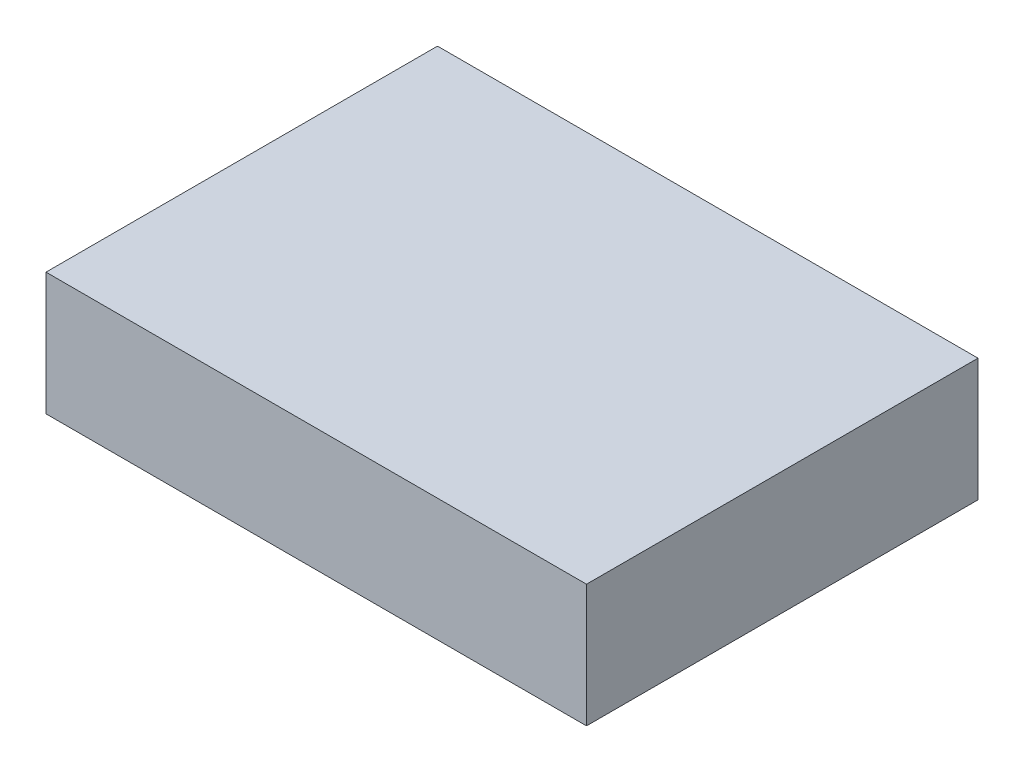
ISO-10303-21;
HEADER;
FILE_DESCRIPTION(('STEP AP214'),'2;1');
FILE_NAME('part.step','',(''),(''),'','','');
FILE_SCHEMA(('AUTOMOTIVE_DESIGN { 1 0 10303 214 1 1 1 1 }'));
ENDSEC;
DATA;
#1=APPLICATION_CONTEXT('core data for automotive mechanical design processes');
#2=APPLICATION_PROTOCOL_DEFINITION('international standard','automotive_design',2000,#1);
#3=PRODUCT_CONTEXT('',#1,'mechanical');
#4=PRODUCT('Part','Part','',(#3));
#5=PRODUCT_RELATED_PRODUCT_CATEGORY('part','',(#4));
#6=PRODUCT_DEFINITION_FORMATION('','',#4);
#7=PRODUCT_DEFINITION_CONTEXT('part definition',#1,'design');
#8=PRODUCT_DEFINITION('design','',#6,#7);
#9=PRODUCT_DEFINITION_SHAPE('','',#8);
#10=(LENGTH_UNIT() NAMED_UNIT(*) SI_UNIT(.MILLI.,.METRE.));
#11=(NAMED_UNIT(*) PLANE_ANGLE_UNIT() SI_UNIT($,.RADIAN.));
#12=(NAMED_UNIT(*) SI_UNIT($,.STERADIAN.) SOLID_ANGLE_UNIT());
#13=UNCERTAINTY_MEASURE_WITH_UNIT(LENGTH_MEASURE(1.E-05),#10,'distance_accuracy_value','');
#14=(GEOMETRIC_REPRESENTATION_CONTEXT(3) GLOBAL_UNCERTAINTY_ASSIGNED_CONTEXT((#13)) GLOBAL_UNIT_ASSIGNED_CONTEXT((#10,
#11,#12)) REPRESENTATION_CONTEXT('',''));
#15=CARTESIAN_POINT('',(0.,0.,0.));
#16=DIRECTION('',(0.,0.,1.));
#17=DIRECTION('',(1.,0.,0.));
#18=AXIS2_PLACEMENT_3D('',#15,#16,#17);
#19=CARTESIAN_POINT('',(0.,21.,0.));
#20=DIRECTION('',(1.,0.,0.));
#21=DIRECTION('',(0.,0.,-1.));
#22=AXIS2_PLACEMENT_3D('',#19,#20,#21);
#23=PLANE('',#22);
#24=DIRECTION('',(0.,0.,1.));
#25=VECTOR('',#24,1.);
#26=CARTESIAN_POINT('',(0.,0.,0.));
#27=LINE('',#26,#25);
#28=CARTESIAN_POINT('',(0.,0.,-67.));
#29=VERTEX_POINT('',#28);
#30=CARTESIAN_POINT('',(0.,0.,0.));
#31=VERTEX_POINT('',#30);
#32=EDGE_CURVE('E107',#29,#31,#27,.T.);
#33=ORIENTED_EDGE('',*,*,#32,.T.);
#34=DIRECTION('',(0.,-1.,0.));
#35=VECTOR('',#34,1.);
#36=CARTESIAN_POINT('',(0.,21.,0.));
#37=LINE('',#36,#35);
#38=CARTESIAN_POINT('',(0.,21.,0.));
#39=VERTEX_POINT('',#38);
#40=EDGE_CURVE('E11',#39,#31,#37,.T.);
#41=ORIENTED_EDGE('',*,*,#40,.F.);
#42=DIRECTION('',(0.,0.,1.));
#43=VECTOR('',#42,1.);
#44=CARTESIAN_POINT('',(0.,21.,0.));
#45=LINE('',#44,#43);
#46=CARTESIAN_POINT('',(0.,21.,-67.));
#47=VERTEX_POINT('',#46);
#48=EDGE_CURVE('E91',#47,#39,#45,.T.);
#49=ORIENTED_EDGE('',*,*,#48,.F.);
#50=DIRECTION('',(0.,-1.,0.));
#51=VECTOR('',#50,1.);
#52=CARTESIAN_POINT('',(0.,21.,-67.));
#53=LINE('',#52,#51);
#54=EDGE_CURVE('E103',#47,#29,#53,.T.);
#55=ORIENTED_EDGE('',*,*,#54,.T.);
#56=EDGE_LOOP('',(#33,#41,#49,#55));
#57=FACE_BOUND('',#56,.T.);
#58=ADVANCED_FACE('F39',(#57),#23,.F.);
#59=CARTESIAN_POINT('',(0.,21.,0.));
#60=DIRECTION('',(0.,0.,-1.));
#61=DIRECTION('',(-1.,0.,0.));
#62=AXIS2_PLACEMENT_3D('',#59,#60,#61);
#63=PLANE('',#62);
#64=DIRECTION('',(1.,0.,0.));
#65=VECTOR('',#64,1.);
#66=CARTESIAN_POINT('',(0.,0.,0.));
#67=LINE('',#66,#65);
#68=CARTESIAN_POINT('',(92.5,0.,0.));
#69=VERTEX_POINT('',#68);
#70=EDGE_CURVE('E96',#31,#69,#67,.T.);
#71=ORIENTED_EDGE('',*,*,#70,.T.);
#72=DIRECTION('',(0.,-1.,0.));
#73=VECTOR('',#72,1.);
#74=CARTESIAN_POINT('',(92.5,21.,0.));
#75=LINE('',#74,#73);
#76=CARTESIAN_POINT('',(92.5,21.,0.));
#77=VERTEX_POINT('',#76);
#78=EDGE_CURVE('E48',#77,#69,#75,.T.);
#79=ORIENTED_EDGE('',*,*,#78,.F.);
#80=DIRECTION('',(1.,0.,0.));
#81=VECTOR('',#80,1.);
#82=CARTESIAN_POINT('',(0.,21.,0.));
#83=LINE('',#82,#81);
#84=EDGE_CURVE('E86',#39,#77,#83,.T.);
#85=ORIENTED_EDGE('',*,*,#84,.F.);
#86=ORIENTED_EDGE('',*,*,#40,.T.);
#87=EDGE_LOOP('',(#71,#79,#85,#86));
#88=FACE_BOUND('',#87,.T.);
#89=ADVANCED_FACE('F95',(#88),#63,.F.);
#90=CARTESIAN_POINT('',(92.5,21.,0.));
#91=DIRECTION('',(-1.,0.,0.));
#92=DIRECTION('',(0.,0.,1.));
#93=AXIS2_PLACEMENT_3D('',#90,#91,#92);
#94=PLANE('',#93);
#95=DIRECTION('',(0.,0.,-1.));
#96=VECTOR('',#95,1.);
#97=CARTESIAN_POINT('',(92.5,0.,0.));
#98=LINE('',#97,#96);
#99=CARTESIAN_POINT('',(92.5,0.,-67.));
#100=VERTEX_POINT('',#99);
#101=EDGE_CURVE('E73',#69,#100,#98,.T.);
#102=ORIENTED_EDGE('',*,*,#101,.T.);
#103=DIRECTION('',(0.,-1.,0.));
#104=VECTOR('',#103,1.);
#105=CARTESIAN_POINT('',(92.5,21.,-67.));
#106=LINE('',#105,#104);
#107=CARTESIAN_POINT('',(92.5,21.,-67.));
#108=VERTEX_POINT('',#107);
#109=EDGE_CURVE('E98',#108,#100,#106,.T.);
#110=ORIENTED_EDGE('',*,*,#109,.F.);
#111=DIRECTION('',(0.,0.,-1.));
#112=VECTOR('',#111,1.);
#113=CARTESIAN_POINT('',(92.5,21.,0.));
#114=LINE('',#113,#112);
#115=EDGE_CURVE('E89',#77,#108,#114,.T.);
#116=ORIENTED_EDGE('',*,*,#115,.F.);
#117=ORIENTED_EDGE('',*,*,#78,.T.);
#118=EDGE_LOOP('',(#102,#110,#116,#117));
#119=FACE_BOUND('',#118,.T.);
#120=ADVANCED_FACE('F99',(#119),#94,.F.);
#121=CARTESIAN_POINT('',(0.,21.,-67.));
#122=DIRECTION('',(0.,0.,1.));
#123=DIRECTION('',(1.,0.,0.));
#124=AXIS2_PLACEMENT_3D('',#121,#122,#123);
#125=PLANE('',#124);
#126=DIRECTION('',(-1.,0.,0.));
#127=VECTOR('',#126,1.);
#128=CARTESIAN_POINT('',(0.,0.,-67.));
#129=LINE('',#128,#127);
#130=EDGE_CURVE('E79',#100,#29,#129,.T.);
#131=ORIENTED_EDGE('',*,*,#130,.T.);
#132=ORIENTED_EDGE('',*,*,#54,.F.);
#133=DIRECTION('',(-1.,0.,0.));
#134=VECTOR('',#133,1.);
#135=CARTESIAN_POINT('',(0.,21.,-67.));
#136=LINE('',#135,#134);
#137=EDGE_CURVE('E56',#108,#47,#136,.T.);
#138=ORIENTED_EDGE('',*,*,#137,.F.);
#139=ORIENTED_EDGE('',*,*,#109,.T.);
#140=EDGE_LOOP('',(#131,#132,#138,#139));
#141=FACE_BOUND('',#140,.T.);
#142=ADVANCED_FACE('F120',(#141),#125,.F.);
#143=CARTESIAN_POINT('',(0.,21.,0.));
#144=DIRECTION('',(0.,-1.,0.));
#145=DIRECTION('',(0.,0.,-1.));
#146=AXIS2_PLACEMENT_3D('',#143,#144,#145);
#147=PLANE('',#146);
#148=ORIENTED_EDGE('',*,*,#48,.T.);
#149=ORIENTED_EDGE('',*,*,#84,.T.);
#150=ORIENTED_EDGE('',*,*,#115,.T.);
#151=ORIENTED_EDGE('',*,*,#137,.T.);
#152=EDGE_LOOP('',(#148,#149,#150,#151));
#153=FACE_BOUND('',#152,.T.);
#154=ADVANCED_FACE('F87',(#153),#147,.F.);
#155=CARTESIAN_POINT('',(0.,0.,0.));
#156=DIRECTION('',(0.,-1.,0.));
#157=DIRECTION('',(0.,0.,-1.));
#158=AXIS2_PLACEMENT_3D('',#155,#156,#157);
#159=PLANE('',#158);
#160=ORIENTED_EDGE('',*,*,#32,.F.);
#161=ORIENTED_EDGE('',*,*,#130,.F.);
#162=ORIENTED_EDGE('',*,*,#101,.F.);
#163=ORIENTED_EDGE('',*,*,#70,.F.);
#164=EDGE_LOOP('',(#160,#161,#162,#163));
#165=FACE_BOUND('',#164,.T.);
#166=ADVANCED_FACE('F123',(#165),#159,.T.);
#167=CLOSED_SHELL('',(#58,#89,#120,#142,#154,#166));
#168=MANIFOLD_SOLID_BREP('B2',#167);
#169=ADVANCED_BREP_SHAPE_REPRESENTATION('',(#18,#168),#14);
#170=SHAPE_DEFINITION_REPRESENTATION(#9,#169);
ENDSEC;
END-ISO-10303-21;
